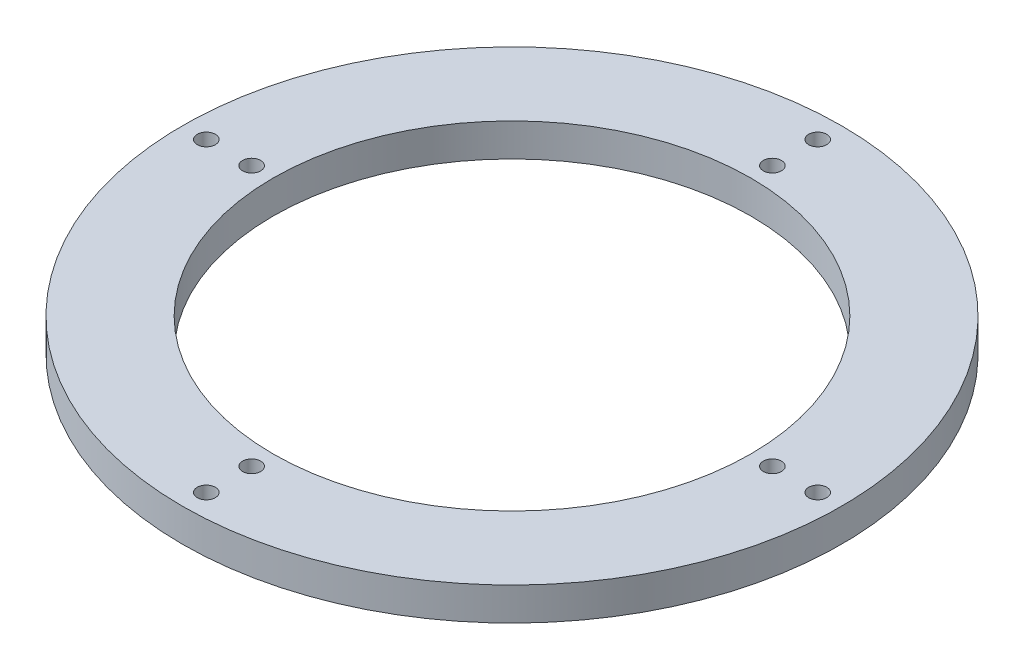
ISO-10303-21;
HEADER;
FILE_DESCRIPTION(('STEP AP214'),'2;1');
FILE_NAME('part.step','',(''),(''),'','','');
FILE_SCHEMA(('AUTOMOTIVE_DESIGN { 1 0 10303 214 1 1 1 1 }'));
ENDSEC;
DATA;
#1=APPLICATION_CONTEXT('core data for automotive mechanical design processes');
#2=APPLICATION_PROTOCOL_DEFINITION('international standard','automotive_design',2000,#1);
#3=PRODUCT_CONTEXT('',#1,'mechanical');
#4=PRODUCT('Part','Part','',(#3));
#5=PRODUCT_RELATED_PRODUCT_CATEGORY('part','',(#4));
#6=PRODUCT_DEFINITION_FORMATION('','',#4);
#7=PRODUCT_DEFINITION_CONTEXT('part definition',#1,'design');
#8=PRODUCT_DEFINITION('design','',#6,#7);
#9=PRODUCT_DEFINITION_SHAPE('','',#8);
#10=(LENGTH_UNIT() NAMED_UNIT(*) SI_UNIT(.MILLI.,.METRE.));
#11=(NAMED_UNIT(*) PLANE_ANGLE_UNIT() SI_UNIT($,.RADIAN.));
#12=(NAMED_UNIT(*) SI_UNIT($,.STERADIAN.) SOLID_ANGLE_UNIT());
#13=UNCERTAINTY_MEASURE_WITH_UNIT(LENGTH_MEASURE(1.E-05),#10,'distance_accuracy_value','');
#14=(GEOMETRIC_REPRESENTATION_CONTEXT(3) GLOBAL_UNCERTAINTY_ASSIGNED_CONTEXT((#13)) GLOBAL_UNIT_ASSIGNED_CONTEXT((#10,
#11,#12)) REPRESENTATION_CONTEXT('',''));
#15=CARTESIAN_POINT('',(0.,0.,0.));
#16=DIRECTION('',(0.,0.,1.));
#17=DIRECTION('',(1.,0.,0.));
#18=AXIS2_PLACEMENT_3D('',#15,#16,#17);
#19=CARTESIAN_POINT('',(0.,10.,0.));
#20=DIRECTION('',(0.,1.,0.));
#21=DIRECTION('',(0.,0.,1.));
#22=AXIS2_PLACEMENT_3D('',#19,#20,#21);
#23=PLANE('',#22);
#24=CARTESIAN_POINT('',(-8.27598090908967E-13,10.,79.0111713426469));
#25=DIRECTION('',(0.,1.,0.));
#26=DIRECTION('',(0.,0.,1.));
#27=AXIS2_PLACEMENT_3D('',#24,#25,#26);
#28=CIRCLE('',#27,2.75000000000001);
#29=CARTESIAN_POINT('',(-8.27598090908967E-13,10.,81.761171342647));
#30=VERTEX_POINT('',#29);
#31=EDGE_CURVE('E84',#30,#30,#28,.T.);
#32=ORIENTED_EDGE('',*,*,#31,.F.);
#33=EDGE_LOOP('',(#32));
#34=FACE_BOUND('',#33,.T.);
#35=CARTESIAN_POINT('',(92.7611713426469,10.,6.47747797424164E-13));
#36=DIRECTION('',(0.,1.,0.));
#37=DIRECTION('',(0.,0.,1.));
#38=AXIS2_PLACEMENT_3D('',#35,#36,#37);
#39=CIRCLE('',#38,2.75);
#40=CARTESIAN_POINT('',(92.7611713426469,10.,2.75000000000065));
#41=VERTEX_POINT('',#40);
#42=EDGE_CURVE('E72',#41,#41,#39,.T.);
#43=ORIENTED_EDGE('',*,*,#42,.F.);
#44=EDGE_LOOP('',(#43));
#45=FACE_BOUND('',#44,.T.);
#46=CARTESIAN_POINT('',(3.23873898712082E-13,10.,-92.7611713426469));
#47=DIRECTION('',(0.,1.,0.));
#48=DIRECTION('',(0.,0.,1.));
#49=AXIS2_PLACEMENT_3D('',#46,#47,#48);
#50=CIRCLE('',#49,2.75000000000001);
#51=CARTESIAN_POINT('',(3.23873898712082E-13,10.,-90.0111713426469));
#52=VERTEX_POINT('',#51);
#53=EDGE_CURVE('E60',#52,#52,#50,.T.);
#54=ORIENTED_EDGE('',*,*,#53,.F.);
#55=EDGE_LOOP('',(#54));
#56=FACE_BOUND('',#55,.T.);
#57=CARTESIAN_POINT('',(-79.0111713426469,10.,0.));
#58=DIRECTION('',(0.,1.,0.));
#59=DIRECTION('',(0.,0.,1.));
#60=AXIS2_PLACEMENT_3D('',#57,#58,#59);
#61=CIRCLE('',#60,2.75000000000001);
#62=CARTESIAN_POINT('',(-79.0111713426469,10.,2.75000000000001));
#63=VERTEX_POINT('',#62);
#64=EDGE_CURVE('E48',#63,#63,#61,.T.);
#65=ORIENTED_EDGE('',*,*,#64,.F.);
#66=EDGE_LOOP('',(#65));
#67=FACE_BOUND('',#66,.T.);
#68=CARTESIAN_POINT('',(0.,10.,0.));
#69=DIRECTION('',(0.,1.,0.));
#70=DIRECTION('',(0.,0.,1.));
#71=AXIS2_PLACEMENT_3D('',#68,#69,#70);
#72=CIRCLE('',#71,100.);
#73=CARTESIAN_POINT('',(0.,10.,100.));
#74=VERTEX_POINT('',#73);
#75=EDGE_CURVE('E10',#74,#74,#72,.T.);
#76=ORIENTED_EDGE('',*,*,#75,.T.);
#77=EDGE_LOOP('',(#76));
#78=FACE_BOUND('',#77,.T.);
#79=CARTESIAN_POINT('',(0.,10.,0.));
#80=DIRECTION('',(0.,1.,0.));
#81=DIRECTION('',(0.,0.,1.));
#82=AXIS2_PLACEMENT_3D('',#79,#80,#81);
#83=CIRCLE('',#82,72.5);
#84=CARTESIAN_POINT('',(0.,10.,72.5));
#85=VERTEX_POINT('',#84);
#86=EDGE_CURVE('E43',#85,#85,#83,.T.);
#87=ORIENTED_EDGE('',*,*,#86,.F.);
#88=EDGE_LOOP('',(#87));
#89=FACE_BOUND('',#88,.T.);
#90=CARTESIAN_POINT('',(2.75866030302989E-13,10.,-79.0111713426469));
#91=DIRECTION('',(0.,1.,0.));
#92=DIRECTION('',(0.,0.,1.));
#93=AXIS2_PLACEMENT_3D('',#90,#91,#92);
#94=CIRCLE('',#93,2.75000000000001);
#95=CARTESIAN_POINT('',(2.75866030302989E-13,10.,-76.2611713426469));
#96=VERTEX_POINT('',#95);
#97=EDGE_CURVE('E54',#96,#96,#94,.T.);
#98=ORIENTED_EDGE('',*,*,#97,.F.);
#99=EDGE_LOOP('',(#98));
#100=FACE_BOUND('',#99,.T.);
#101=CARTESIAN_POINT('',(79.0111713426469,10.,5.51732060605978E-13));
#102=DIRECTION('',(0.,1.,0.));
#103=DIRECTION('',(0.,0.,1.));
#104=AXIS2_PLACEMENT_3D('',#101,#102,#103);
#105=CIRCLE('',#104,2.75);
#106=CARTESIAN_POINT('',(79.0111713426469,10.,2.75000000000055));
#107=VERTEX_POINT('',#106);
#108=EDGE_CURVE('E66',#107,#107,#105,.T.);
#109=ORIENTED_EDGE('',*,*,#108,.F.);
#110=EDGE_LOOP('',(#109));
#111=FACE_BOUND('',#110,.T.);
#112=CARTESIAN_POINT('',(-92.7611713426469,10.,0.));
#113=DIRECTION('',(0.,1.,0.));
#114=DIRECTION('',(0.,0.,1.));
#115=AXIS2_PLACEMENT_3D('',#112,#113,#114);
#116=CIRCLE('',#115,2.75000000000001);
#117=CARTESIAN_POINT('',(-92.7611713426469,10.,2.75000000000001));
#118=VERTEX_POINT('',#117);
#119=EDGE_CURVE('E78',#118,#118,#116,.T.);
#120=ORIENTED_EDGE('',*,*,#119,.F.);
#121=EDGE_LOOP('',(#120));
#122=FACE_BOUND('',#121,.T.);
#123=CARTESIAN_POINT('',(-9.71621696136246E-13,10.,92.7611713426469));
#124=DIRECTION('',(0.,1.,0.));
#125=DIRECTION('',(0.,0.,1.));
#126=AXIS2_PLACEMENT_3D('',#123,#124,#125);
#127=CIRCLE('',#126,2.75000000000001);
#128=CARTESIAN_POINT('',(-9.71621696136246E-13,10.,95.511171342647));
#129=VERTEX_POINT('',#128);
#130=EDGE_CURVE('E90',#129,#129,#127,.T.);
#131=ORIENTED_EDGE('',*,*,#130,.F.);
#132=EDGE_LOOP('',(#131));
#133=FACE_BOUND('',#132,.T.);
#134=ADVANCED_FACE('F32',(#34,#45,#56,#67,#78,#89,#100,#111,#122,#133),#23,.T.);
#135=CARTESIAN_POINT('',(0.,0.,0.));
#136=DIRECTION('',(0.,1.,0.));
#137=DIRECTION('',(0.,0.,1.));
#138=AXIS2_PLACEMENT_3D('',#135,#136,#137);
#139=PLANE('',#138);
#140=CARTESIAN_POINT('',(0.,0.,0.));
#141=DIRECTION('',(0.,1.,0.));
#142=DIRECTION('',(0.,0.,1.));
#143=AXIS2_PLACEMENT_3D('',#140,#141,#142);
#144=CIRCLE('',#143,100.);
#145=CARTESIAN_POINT('',(0.,0.,100.));
#146=VERTEX_POINT('',#145);
#147=EDGE_CURVE('E36',#146,#146,#144,.T.);
#148=ORIENTED_EDGE('',*,*,#147,.F.);
#149=EDGE_LOOP('',(#148));
#150=FACE_BOUND('',#149,.T.);
#151=CARTESIAN_POINT('',(0.,0.,0.));
#152=DIRECTION('',(0.,1.,0.));
#153=DIRECTION('',(0.,0.,1.));
#154=AXIS2_PLACEMENT_3D('',#151,#152,#153);
#155=CIRCLE('',#154,72.5);
#156=CARTESIAN_POINT('',(0.,0.,72.5));
#157=VERTEX_POINT('',#156);
#158=EDGE_CURVE('E45',#157,#157,#155,.T.);
#159=ORIENTED_EDGE('',*,*,#158,.T.);
#160=EDGE_LOOP('',(#159));
#161=FACE_BOUND('',#160,.T.);
#162=CARTESIAN_POINT('',(-79.0111713426469,0.,0.));
#163=DIRECTION('',(0.,1.,0.));
#164=DIRECTION('',(0.,0.,1.));
#165=AXIS2_PLACEMENT_3D('',#162,#163,#164);
#166=CIRCLE('',#165,2.75000000000001);
#167=CARTESIAN_POINT('',(-79.0111713426469,0.,2.75000000000001));
#168=VERTEX_POINT('',#167);
#169=EDGE_CURVE('E51',#168,#168,#166,.T.);
#170=ORIENTED_EDGE('',*,*,#169,.T.);
#171=EDGE_LOOP('',(#170));
#172=FACE_BOUND('',#171,.T.);
#173=CARTESIAN_POINT('',(2.75866030302989E-13,0.,-79.0111713426469));
#174=DIRECTION('',(0.,1.,0.));
#175=DIRECTION('',(0.,0.,1.));
#176=AXIS2_PLACEMENT_3D('',#173,#174,#175);
#177=CIRCLE('',#176,2.75000000000001);
#178=CARTESIAN_POINT('',(2.75866030302989E-13,0.,-76.2611713426469));
#179=VERTEX_POINT('',#178);
#180=EDGE_CURVE('E57',#179,#179,#177,.T.);
#181=ORIENTED_EDGE('',*,*,#180,.T.);
#182=EDGE_LOOP('',(#181));
#183=FACE_BOUND('',#182,.T.);
#184=CARTESIAN_POINT('',(3.23873898712082E-13,0.,-92.7611713426469));
#185=DIRECTION('',(0.,1.,0.));
#186=DIRECTION('',(0.,0.,1.));
#187=AXIS2_PLACEMENT_3D('',#184,#185,#186);
#188=CIRCLE('',#187,2.75000000000001);
#189=CARTESIAN_POINT('',(3.23873898712082E-13,0.,-90.0111713426469));
#190=VERTEX_POINT('',#189);
#191=EDGE_CURVE('E63',#190,#190,#188,.T.);
#192=ORIENTED_EDGE('',*,*,#191,.T.);
#193=EDGE_LOOP('',(#192));
#194=FACE_BOUND('',#193,.T.);
#195=CARTESIAN_POINT('',(79.0111713426469,0.,5.51732060605978E-13));
#196=DIRECTION('',(0.,1.,0.));
#197=DIRECTION('',(0.,0.,1.));
#198=AXIS2_PLACEMENT_3D('',#195,#196,#197);
#199=CIRCLE('',#198,2.75);
#200=CARTESIAN_POINT('',(79.0111713426469,0.,2.75000000000055));
#201=VERTEX_POINT('',#200);
#202=EDGE_CURVE('E69',#201,#201,#199,.T.);
#203=ORIENTED_EDGE('',*,*,#202,.T.);
#204=EDGE_LOOP('',(#203));
#205=FACE_BOUND('',#204,.T.);
#206=CARTESIAN_POINT('',(92.7611713426469,0.,6.47747797424164E-13));
#207=DIRECTION('',(0.,1.,0.));
#208=DIRECTION('',(0.,0.,1.));
#209=AXIS2_PLACEMENT_3D('',#206,#207,#208);
#210=CIRCLE('',#209,2.75);
#211=CARTESIAN_POINT('',(92.7611713426469,0.,2.75000000000065));
#212=VERTEX_POINT('',#211);
#213=EDGE_CURVE('E75',#212,#212,#210,.T.);
#214=ORIENTED_EDGE('',*,*,#213,.T.);
#215=EDGE_LOOP('',(#214));
#216=FACE_BOUND('',#215,.T.);
#217=CARTESIAN_POINT('',(-92.7611713426469,0.,0.));
#218=DIRECTION('',(0.,1.,0.));
#219=DIRECTION('',(0.,0.,1.));
#220=AXIS2_PLACEMENT_3D('',#217,#218,#219);
#221=CIRCLE('',#220,2.75000000000001);
#222=CARTESIAN_POINT('',(-92.7611713426469,0.,2.75000000000001));
#223=VERTEX_POINT('',#222);
#224=EDGE_CURVE('E81',#223,#223,#221,.T.);
#225=ORIENTED_EDGE('',*,*,#224,.T.);
#226=EDGE_LOOP('',(#225));
#227=FACE_BOUND('',#226,.T.);
#228=CARTESIAN_POINT('',(-8.27598090908967E-13,0.,79.0111713426469));
#229=DIRECTION('',(0.,1.,0.));
#230=DIRECTION('',(0.,0.,1.));
#231=AXIS2_PLACEMENT_3D('',#228,#229,#230);
#232=CIRCLE('',#231,2.75000000000001);
#233=CARTESIAN_POINT('',(-8.27598090908967E-13,0.,81.761171342647));
#234=VERTEX_POINT('',#233);
#235=EDGE_CURVE('E87',#234,#234,#232,.T.);
#236=ORIENTED_EDGE('',*,*,#235,.T.);
#237=EDGE_LOOP('',(#236));
#238=FACE_BOUND('',#237,.T.);
#239=CARTESIAN_POINT('',(-9.71621696136246E-13,0.,92.7611713426469));
#240=DIRECTION('',(0.,1.,0.));
#241=DIRECTION('',(0.,0.,1.));
#242=AXIS2_PLACEMENT_3D('',#239,#240,#241);
#243=CIRCLE('',#242,2.75000000000001);
#244=CARTESIAN_POINT('',(-9.71621696136246E-13,0.,95.511171342647));
#245=VERTEX_POINT('',#244);
#246=EDGE_CURVE('E93',#245,#245,#243,.T.);
#247=ORIENTED_EDGE('',*,*,#246,.T.);
#248=EDGE_LOOP('',(#247));
#249=FACE_BOUND('',#248,.T.);
#250=ADVANCED_FACE('F103',(#150,#161,#172,#183,#194,#205,#216,#227,#238,#249),#139,.F.);
#251=CARTESIAN_POINT('',(0.,10.,0.));
#252=DIRECTION('',(0.,-1.,0.));
#253=DIRECTION('',(0.,0.,-1.));
#254=AXIS2_PLACEMENT_3D('',#251,#252,#253);
#255=CYLINDRICAL_SURFACE('',#254,100.);
#256=ORIENTED_EDGE('',*,*,#75,.F.);
#257=EDGE_LOOP('',(#256));
#258=FACE_BOUND('',#257,.T.);
#259=ORIENTED_EDGE('',*,*,#147,.T.);
#260=EDGE_LOOP('',(#259));
#261=FACE_BOUND('',#260,.T.);
#262=ADVANCED_FACE('F34',(#258,#261),#255,.T.);
#263=CARTESIAN_POINT('',(0.,10.,0.));
#264=DIRECTION('',(0.,-1.,0.));
#265=DIRECTION('',(0.,0.,-1.));
#266=AXIS2_PLACEMENT_3D('',#263,#264,#265);
#267=CYLINDRICAL_SURFACE('',#266,72.5);
#268=ORIENTED_EDGE('',*,*,#86,.T.);
#269=EDGE_LOOP('',(#268));
#270=FACE_BOUND('',#269,.T.);
#271=ORIENTED_EDGE('',*,*,#158,.F.);
#272=EDGE_LOOP('',(#271));
#273=FACE_BOUND('',#272,.T.);
#274=ADVANCED_FACE('F113',(#270,#273),#267,.F.);
#275=CARTESIAN_POINT('',(-79.0111713426469,10.,0.));
#276=DIRECTION('',(0.,-1.,0.));
#277=DIRECTION('',(0.,0.,-1.));
#278=AXIS2_PLACEMENT_3D('',#275,#276,#277);
#279=CYLINDRICAL_SURFACE('',#278,2.75000000000001);
#280=ORIENTED_EDGE('',*,*,#64,.T.);
#281=EDGE_LOOP('',(#280));
#282=FACE_BOUND('',#281,.T.);
#283=ORIENTED_EDGE('',*,*,#169,.F.);
#284=EDGE_LOOP('',(#283));
#285=FACE_BOUND('',#284,.T.);
#286=ADVANCED_FACE('F116',(#282,#285),#279,.F.);
#287=CARTESIAN_POINT('',(2.75866030302989E-13,10.,-79.0111713426469));
#288=DIRECTION('',(0.,-1.,0.));
#289=DIRECTION('',(0.,0.,-1.));
#290=AXIS2_PLACEMENT_3D('',#287,#288,#289);
#291=CYLINDRICAL_SURFACE('',#290,2.75000000000001);
#292=ORIENTED_EDGE('',*,*,#97,.T.);
#293=EDGE_LOOP('',(#292));
#294=FACE_BOUND('',#293,.T.);
#295=ORIENTED_EDGE('',*,*,#180,.F.);
#296=EDGE_LOOP('',(#295));
#297=FACE_BOUND('',#296,.T.);
#298=ADVANCED_FACE('F120',(#294,#297),#291,.F.);
#299=CARTESIAN_POINT('',(3.23873898712082E-13,10.,-92.7611713426469));
#300=DIRECTION('',(0.,-1.,0.));
#301=DIRECTION('',(0.,0.,-1.));
#302=AXIS2_PLACEMENT_3D('',#299,#300,#301);
#303=CYLINDRICAL_SURFACE('',#302,2.75000000000001);
#304=ORIENTED_EDGE('',*,*,#53,.T.);
#305=EDGE_LOOP('',(#304));
#306=FACE_BOUND('',#305,.T.);
#307=ORIENTED_EDGE('',*,*,#191,.F.);
#308=EDGE_LOOP('',(#307));
#309=FACE_BOUND('',#308,.T.);
#310=ADVANCED_FACE('F124',(#306,#309),#303,.F.);
#311=CARTESIAN_POINT('',(79.0111713426469,10.,5.51732060605978E-13));
#312=DIRECTION('',(0.,-1.,0.));
#313=DIRECTION('',(0.,0.,-1.));
#314=AXIS2_PLACEMENT_3D('',#311,#312,#313);
#315=CYLINDRICAL_SURFACE('',#314,2.75);
#316=ORIENTED_EDGE('',*,*,#108,.T.);
#317=EDGE_LOOP('',(#316));
#318=FACE_BOUND('',#317,.T.);
#319=ORIENTED_EDGE('',*,*,#202,.F.);
#320=EDGE_LOOP('',(#319));
#321=FACE_BOUND('',#320,.T.);
#322=ADVANCED_FACE('F128',(#318,#321),#315,.F.);
#323=CARTESIAN_POINT('',(92.7611713426469,10.,6.47747797424164E-13));
#324=DIRECTION('',(0.,-1.,0.));
#325=DIRECTION('',(0.,0.,-1.));
#326=AXIS2_PLACEMENT_3D('',#323,#324,#325);
#327=CYLINDRICAL_SURFACE('',#326,2.75);
#328=ORIENTED_EDGE('',*,*,#42,.T.);
#329=EDGE_LOOP('',(#328));
#330=FACE_BOUND('',#329,.T.);
#331=ORIENTED_EDGE('',*,*,#213,.F.);
#332=EDGE_LOOP('',(#331));
#333=FACE_BOUND('',#332,.T.);
#334=ADVANCED_FACE('F132',(#330,#333),#327,.F.);
#335=CARTESIAN_POINT('',(-92.7611713426469,10.,0.));
#336=DIRECTION('',(0.,-1.,0.));
#337=DIRECTION('',(0.,0.,-1.));
#338=AXIS2_PLACEMENT_3D('',#335,#336,#337);
#339=CYLINDRICAL_SURFACE('',#338,2.75000000000001);
#340=ORIENTED_EDGE('',*,*,#119,.T.);
#341=EDGE_LOOP('',(#340));
#342=FACE_BOUND('',#341,.T.);
#343=ORIENTED_EDGE('',*,*,#224,.F.);
#344=EDGE_LOOP('',(#343));
#345=FACE_BOUND('',#344,.T.);
#346=ADVANCED_FACE('F136',(#342,#345),#339,.F.);
#347=CARTESIAN_POINT('',(-8.27598090908967E-13,10.,79.0111713426469));
#348=DIRECTION('',(0.,-1.,0.));
#349=DIRECTION('',(0.,0.,-1.));
#350=AXIS2_PLACEMENT_3D('',#347,#348,#349);
#351=CYLINDRICAL_SURFACE('',#350,2.75000000000001);
#352=ORIENTED_EDGE('',*,*,#31,.T.);
#353=EDGE_LOOP('',(#352));
#354=FACE_BOUND('',#353,.T.);
#355=ORIENTED_EDGE('',*,*,#235,.F.);
#356=EDGE_LOOP('',(#355));
#357=FACE_BOUND('',#356,.T.);
#358=ADVANCED_FACE('F140',(#354,#357),#351,.F.);
#359=CARTESIAN_POINT('',(-9.71621696136246E-13,10.,92.7611713426469));
#360=DIRECTION('',(0.,-1.,0.));
#361=DIRECTION('',(0.,0.,-1.));
#362=AXIS2_PLACEMENT_3D('',#359,#360,#361);
#363=CYLINDRICAL_SURFACE('',#362,2.75000000000001);
#364=ORIENTED_EDGE('',*,*,#130,.T.);
#365=EDGE_LOOP('',(#364));
#366=FACE_BOUND('',#365,.T.);
#367=ORIENTED_EDGE('',*,*,#246,.F.);
#368=EDGE_LOOP('',(#367));
#369=FACE_BOUND('',#368,.T.);
#370=ADVANCED_FACE('F99',(#366,#369),#363,.F.);
#371=CLOSED_SHELL('',(#134,#250,#262,#274,#286,#298,#310,#322,#334,#346,#358,#370));
#372=MANIFOLD_SOLID_BREP('B2',#371);
#373=ADVANCED_BREP_SHAPE_REPRESENTATION('',(#18,#372),#14);
#374=SHAPE_DEFINITION_REPRESENTATION(#9,#373);
ENDSEC;
END-ISO-10303-21;
